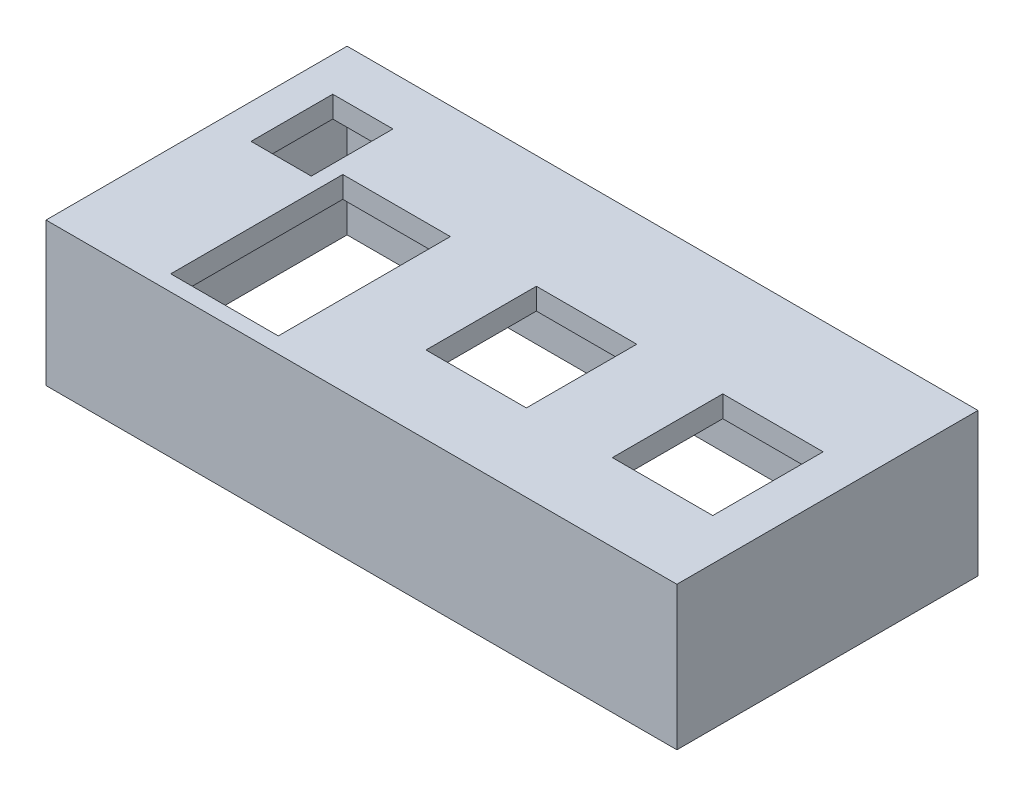
ISO-10303-21;
HEADER;
FILE_DESCRIPTION(('STEP AP214'),'2;1');
FILE_NAME('part.step','',(''),(''),'','','');
FILE_SCHEMA(('AUTOMOTIVE_DESIGN { 1 0 10303 214 1 1 1 1 }'));
ENDSEC;
DATA;
#1=APPLICATION_CONTEXT('core data for automotive mechanical design processes');
#2=APPLICATION_PROTOCOL_DEFINITION('international standard','automotive_design',2000,#1);
#3=PRODUCT_CONTEXT('',#1,'mechanical');
#4=PRODUCT('Part','Part','',(#3));
#5=PRODUCT_RELATED_PRODUCT_CATEGORY('part','',(#4));
#6=PRODUCT_DEFINITION_FORMATION('','',#4);
#7=PRODUCT_DEFINITION_CONTEXT('part definition',#1,'design');
#8=PRODUCT_DEFINITION('design','',#6,#7);
#9=PRODUCT_DEFINITION_SHAPE('','',#8);
#10=(LENGTH_UNIT() NAMED_UNIT(*) SI_UNIT(.MILLI.,.METRE.));
#11=(NAMED_UNIT(*) PLANE_ANGLE_UNIT() SI_UNIT($,.RADIAN.));
#12=(NAMED_UNIT(*) SI_UNIT($,.STERADIAN.) SOLID_ANGLE_UNIT());
#13=UNCERTAINTY_MEASURE_WITH_UNIT(LENGTH_MEASURE(1.E-05),#10,'distance_accuracy_value','');
#14=(GEOMETRIC_REPRESENTATION_CONTEXT(3) GLOBAL_UNCERTAINTY_ASSIGNED_CONTEXT((#13)) GLOBAL_UNIT_ASSIGNED_CONTEXT((#10,
#11,#12)) REPRESENTATION_CONTEXT('',''));
#15=CARTESIAN_POINT('',(0.,0.,0.));
#16=DIRECTION('',(0.,0.,1.));
#17=DIRECTION('',(1.,0.,0.));
#18=AXIS2_PLACEMENT_3D('',#15,#16,#17);
#19=CARTESIAN_POINT('',(0.,20.,0.));
#20=DIRECTION('',(0.,1.,0.));
#21=DIRECTION('',(0.,0.,1.));
#22=AXIS2_PLACEMENT_3D('',#19,#20,#21);
#23=PLANE('',#22);
#24=DIRECTION('',(0.,0.,1.));
#25=VECTOR('',#24,1.);
#26=CARTESIAN_POINT('',(-69.6030626637114,20.,0.590445487080586));
#27=LINE('',#26,#25);
#28=CARTESIAN_POINT('',(-69.6030626637114,20.,0.590445487080586));
#29=VERTEX_POINT('',#28);
#30=CARTESIAN_POINT('',(-69.6030626637114,20.,42.5904454870806));
#31=VERTEX_POINT('',#30);
#32=EDGE_CURVE('E346',#29,#31,#27,.T.);
#33=ORIENTED_EDGE('',*,*,#32,.T.);
#34=DIRECTION('',(1.,0.,0.));
#35=VECTOR('',#34,1.);
#36=CARTESIAN_POINT('',(-69.6030626637114,20.,42.5904454870806));
#37=LINE('',#36,#35);
#38=CARTESIAN_POINT('',(18.3969373362886,20.,42.5904454870806));
#39=VERTEX_POINT('',#38);
#40=EDGE_CURVE('E349',#31,#39,#37,.T.);
#41=ORIENTED_EDGE('',*,*,#40,.T.);
#42=DIRECTION('',(0.,0.,-1.));
#43=VECTOR('',#42,1.);
#44=CARTESIAN_POINT('',(18.3969373362885,20.,0.590445487080586));
#45=LINE('',#44,#43);
#46=CARTESIAN_POINT('',(18.3969373362885,20.,0.590445487080586));
#47=VERTEX_POINT('',#46);
#48=EDGE_CURVE('E352',#39,#47,#45,.T.);
#49=ORIENTED_EDGE('',*,*,#48,.T.);
#50=DIRECTION('',(-1.,0.,0.));
#51=VECTOR('',#50,1.);
#52=CARTESIAN_POINT('',(-69.6030626637114,20.,0.590445487080586));
#53=LINE('',#52,#51);
#54=EDGE_CURVE('E354',#47,#29,#53,.T.);
#55=ORIENTED_EDGE('',*,*,#54,.T.);
#56=EDGE_LOOP('',(#33,#41,#49,#55));
#57=FACE_BOUND('',#56,.T.);
#58=DIRECTION('',(-1.,0.,0.));
#59=VECTOR('',#58,1.);
#60=CARTESIAN_POINT('',(0.,20.,31.7904454870806));
#61=LINE('',#60,#59);
#62=CARTESIAN_POINT('',(12.5969373362886,20.,31.7904454870806));
#63=VERTEX_POINT('',#62);
#64=CARTESIAN_POINT('',(-1.40306266371144,20.,31.7904454870806));
#65=VERTEX_POINT('',#64);
#66=EDGE_CURVE('E307',#63,#65,#61,.T.);
#67=ORIENTED_EDGE('',*,*,#66,.T.);
#68=DIRECTION('',(0.,0.,-1.));
#69=VECTOR('',#68,1.);
#70=CARTESIAN_POINT('',(-1.40306266371144,20.,0.));
#71=LINE('',#70,#69);
#72=CARTESIAN_POINT('',(-1.40306266371144,20.,16.3904454870806));
#73=VERTEX_POINT('',#72);
#74=EDGE_CURVE('E310',#65,#73,#71,.T.);
#75=ORIENTED_EDGE('',*,*,#74,.T.);
#76=DIRECTION('',(1.,0.,0.));
#77=VECTOR('',#76,1.);
#78=CARTESIAN_POINT('',(0.,20.,16.3904454870806));
#79=LINE('',#78,#77);
#80=CARTESIAN_POINT('',(12.5969373362886,20.,16.3904454870806));
#81=VERTEX_POINT('',#80);
#82=EDGE_CURVE('E301',#73,#81,#79,.T.);
#83=ORIENTED_EDGE('',*,*,#82,.T.);
#84=DIRECTION('',(0.,0.,1.));
#85=VECTOR('',#84,1.);
#86=CARTESIAN_POINT('',(12.5969373362886,20.,0.));
#87=LINE('',#86,#85);
#88=EDGE_CURVE('E304',#81,#63,#87,.T.);
#89=ORIENTED_EDGE('',*,*,#88,.T.);
#90=EDGE_LOOP('',(#67,#75,#83,#89));
#91=FACE_BOUND('',#90,.T.);
#92=DIRECTION('',(-1.,0.,0.));
#93=VECTOR('',#92,1.);
#94=CARTESIAN_POINT('',(0.,20.,18.7904454870806));
#95=LINE('',#94,#93);
#96=CARTESIAN_POINT('',(-56.4030626637114,20.,18.7904454870806));
#97=VERTEX_POINT('',#96);
#98=CARTESIAN_POINT('',(-64.8030626637114,20.,18.7904454870806));
#99=VERTEX_POINT('',#98);
#100=EDGE_CURVE('E269',#97,#99,#95,.T.);
#101=ORIENTED_EDGE('',*,*,#100,.T.);
#102=DIRECTION('',(0.,0.,-1.));
#103=VECTOR('',#102,1.);
#104=CARTESIAN_POINT('',(-64.8030626637114,20.,0.));
#105=LINE('',#104,#103);
#106=CARTESIAN_POINT('',(-64.8030626637114,20.,7.39044548708059));
#107=VERTEX_POINT('',#106);
#108=EDGE_CURVE('E272',#99,#107,#105,.T.);
#109=ORIENTED_EDGE('',*,*,#108,.T.);
#110=DIRECTION('',(1.,0.,0.));
#111=VECTOR('',#110,1.);
#112=CARTESIAN_POINT('',(0.,20.,7.39044548708059));
#113=LINE('',#112,#111);
#114=CARTESIAN_POINT('',(-56.4030626637114,20.,7.39044548708059));
#115=VERTEX_POINT('',#114);
#116=EDGE_CURVE('E263',#107,#115,#113,.T.);
#117=ORIENTED_EDGE('',*,*,#116,.T.);
#118=DIRECTION('',(0.,0.,1.));
#119=VECTOR('',#118,1.);
#120=CARTESIAN_POINT('',(-56.4030626637114,20.,0.));
#121=LINE('',#120,#119);
#122=EDGE_CURVE('E266',#115,#97,#121,.T.);
#123=ORIENTED_EDGE('',*,*,#122,.T.);
#124=EDGE_LOOP('',(#101,#109,#117,#123));
#125=FACE_BOUND('',#124,.T.);
#126=DIRECTION('',(-1.,0.,0.));
#127=VECTOR('',#126,1.);
#128=CARTESIAN_POINT('',(0.,20.,40.3904454870806));
#129=LINE('',#128,#127);
#130=CARTESIAN_POINT('',(-39.4030626637114,20.,40.3904454870806));
#131=VERTEX_POINT('',#130);
#132=CARTESIAN_POINT('',(-54.4030626637114,20.,40.3904454870806));
#133=VERTEX_POINT('',#132);
#134=EDGE_CURVE('E261',#131,#133,#129,.T.);
#135=ORIENTED_EDGE('',*,*,#134,.T.);
#136=DIRECTION('',(0.,0.,-1.));
#137=VECTOR('',#136,1.);
#138=CARTESIAN_POINT('',(-54.4030626637114,20.,0.));
#139=LINE('',#138,#137);
#140=CARTESIAN_POINT('',(-54.4030626637114,20.,16.3904454870806));
#141=VERTEX_POINT('',#140);
#142=EDGE_CURVE('E212',#133,#141,#139,.T.);
#143=ORIENTED_EDGE('',*,*,#142,.T.);
#144=DIRECTION('',(1.,0.,0.));
#145=VECTOR('',#144,1.);
#146=CARTESIAN_POINT('',(0.,20.,16.3904454870806));
#147=LINE('',#146,#145);
#148=CARTESIAN_POINT('',(-39.4030626637114,20.,16.3904454870806));
#149=VERTEX_POINT('',#148);
#150=EDGE_CURVE('E275',#141,#149,#147,.T.);
#151=ORIENTED_EDGE('',*,*,#150,.T.);
#152=DIRECTION('',(0.,0.,1.));
#153=VECTOR('',#152,1.);
#154=CARTESIAN_POINT('',(-39.4030626637114,20.,0.));
#155=LINE('',#154,#153);
#156=EDGE_CURVE('E255',#149,#131,#155,.T.);
#157=ORIENTED_EDGE('',*,*,#156,.T.);
#158=EDGE_LOOP('',(#135,#143,#151,#157));
#159=FACE_BOUND('',#158,.T.);
#160=DIRECTION('',(-1.,0.,0.));
#161=VECTOR('',#160,1.);
#162=CARTESIAN_POINT('',(0.,20.,31.7904454870806));
#163=LINE('',#162,#161);
#164=CARTESIAN_POINT('',(-13.4030626637114,20.,31.7904454870806));
#165=VERTEX_POINT('',#164);
#166=CARTESIAN_POINT('',(-27.4030626637114,20.,31.7904454870806));
#167=VERTEX_POINT('',#166);
#168=EDGE_CURVE('E284',#165,#167,#163,.T.);
#169=ORIENTED_EDGE('',*,*,#168,.T.);
#170=DIRECTION('',(0.,0.,-1.));
#171=VECTOR('',#170,1.);
#172=CARTESIAN_POINT('',(-27.4030626637114,20.,0.));
#173=LINE('',#172,#171);
#174=CARTESIAN_POINT('',(-27.4030626637114,20.,16.3904454870806));
#175=VERTEX_POINT('',#174);
#176=EDGE_CURVE('E287',#167,#175,#173,.T.);
#177=ORIENTED_EDGE('',*,*,#176,.T.);
#178=DIRECTION('',(1.,0.,0.));
#179=VECTOR('',#178,1.);
#180=CARTESIAN_POINT('',(0.,20.,16.3904454870806));
#181=LINE('',#180,#179);
#182=CARTESIAN_POINT('',(-13.4030626637114,20.,16.3904454870806));
#183=VERTEX_POINT('',#182);
#184=EDGE_CURVE('E278',#175,#183,#181,.T.);
#185=ORIENTED_EDGE('',*,*,#184,.T.);
#186=DIRECTION('',(0.,0.,1.));
#187=VECTOR('',#186,1.);
#188=CARTESIAN_POINT('',(-13.4030626637114,20.,0.));
#189=LINE('',#188,#187);
#190=EDGE_CURVE('E281',#183,#165,#189,.T.);
#191=ORIENTED_EDGE('',*,*,#190,.T.);
#192=EDGE_LOOP('',(#169,#177,#185,#191));
#193=FACE_BOUND('',#192,.T.);
#194=ADVANCED_FACE('F32',(#57,#91,#125,#159,#193),#23,.T.);
#195=CARTESIAN_POINT('',(0.,17.,0.));
#196=DIRECTION('',(0.,1.,0.));
#197=DIRECTION('',(0.,0.,1.));
#198=AXIS2_PLACEMENT_3D('',#195,#196,#197);
#199=PLANE('',#198);
#200=DIRECTION('',(0.,0.,-1.));
#201=VECTOR('',#200,1.);
#202=CARTESIAN_POINT('',(-54.4030626637114,17.,0.));
#203=LINE('',#202,#201);
#204=CARTESIAN_POINT('',(-54.4030626637114,17.,39.7904454870806));
#205=VERTEX_POINT('',#204);
#206=CARTESIAN_POINT('',(-54.4030626637114,17.,16.3904454870806));
#207=VERTEX_POINT('',#206);
#208=EDGE_CURVE('E258',#205,#207,#203,.T.);
#209=ORIENTED_EDGE('',*,*,#208,.F.);
#210=DIRECTION('',(1.,0.,0.));
#211=VECTOR('',#210,1.);
#212=CARTESIAN_POINT('',(-66.8030626637114,17.,39.7904454870806));
#213=LINE('',#212,#211);
#214=CARTESIAN_POINT('',(-66.8030626637114,17.,39.7904454870806));
#215=VERTEX_POINT('',#214);
#216=EDGE_CURVE('E319',#215,#205,#213,.T.);
#217=ORIENTED_EDGE('',*,*,#216,.F.);
#218=DIRECTION('',(0.,0.,1.));
#219=VECTOR('',#218,1.);
#220=CARTESIAN_POINT('',(-66.8030626637114,17.,3.39044548708059));
#221=LINE('',#220,#219);
#222=CARTESIAN_POINT('',(-66.8030626637114,17.,3.39044548708059));
#223=VERTEX_POINT('',#222);
#224=EDGE_CURVE('E314',#223,#215,#221,.T.);
#225=ORIENTED_EDGE('',*,*,#224,.F.);
#226=DIRECTION('',(-1.,0.,0.));
#227=VECTOR('',#226,1.);
#228=CARTESIAN_POINT('',(-66.8030626637114,17.,3.39044548708059));
#229=LINE('',#228,#227);
#230=CARTESIAN_POINT('',(15.5969373362886,17.,3.39044548708059));
#231=VERTEX_POINT('',#230);
#232=EDGE_CURVE('E324',#231,#223,#229,.T.);
#233=ORIENTED_EDGE('',*,*,#232,.F.);
#234=DIRECTION('',(0.,0.,-1.));
#235=VECTOR('',#234,1.);
#236=CARTESIAN_POINT('',(15.5969373362886,17.,3.39044548708059));
#237=LINE('',#236,#235);
#238=CARTESIAN_POINT('',(15.5969373362886,17.,39.7904454870806));
#239=VERTEX_POINT('',#238);
#240=EDGE_CURVE('E322',#239,#231,#237,.T.);
#241=ORIENTED_EDGE('',*,*,#240,.F.);
#242=CARTESIAN_POINT('',(-39.4030626637114,17.,39.7904454870806));
#243=VERTEX_POINT('',#242);
#244=EDGE_CURVE('E317',#243,#239,#213,.T.);
#245=ORIENTED_EDGE('',*,*,#244,.F.);
#246=DIRECTION('',(0.,0.,1.));
#247=VECTOR('',#246,1.);
#248=CARTESIAN_POINT('',(-39.4030626637114,17.,0.));
#249=LINE('',#248,#247);
#250=CARTESIAN_POINT('',(-39.4030626637114,17.,16.3904454870806));
#251=VERTEX_POINT('',#250);
#252=EDGE_CURVE('E253',#251,#243,#249,.T.);
#253=ORIENTED_EDGE('',*,*,#252,.F.);
#254=DIRECTION('',(1.,0.,0.));
#255=VECTOR('',#254,1.);
#256=CARTESIAN_POINT('',(0.,17.,16.3904454870806));
#257=LINE('',#256,#255);
#258=EDGE_CURVE('E398',#207,#251,#257,.T.);
#259=ORIENTED_EDGE('',*,*,#258,.F.);
#260=EDGE_LOOP('',(#209,#217,#225,#233,#241,#245,#253,#259));
#261=FACE_BOUND('',#260,.T.);
#262=DIRECTION('',(0.,0.,-1.));
#263=VECTOR('',#262,1.);
#264=CARTESIAN_POINT('',(-1.40306266371144,17.,0.));
#265=LINE('',#264,#263);
#266=CARTESIAN_POINT('',(-1.40306266371144,17.,31.7904454870806));
#267=VERTEX_POINT('',#266);
#268=CARTESIAN_POINT('',(-1.40306266371144,17.,16.3904454870806));
#269=VERTEX_POINT('',#268);
#270=EDGE_CURVE('E381',#267,#269,#265,.T.);
#271=ORIENTED_EDGE('',*,*,#270,.F.);
#272=DIRECTION('',(-1.,0.,0.));
#273=VECTOR('',#272,1.);
#274=CARTESIAN_POINT('',(0.,17.,31.7904454870806));
#275=LINE('',#274,#273);
#276=CARTESIAN_POINT('',(12.5969373362886,17.,31.7904454870806));
#277=VERTEX_POINT('',#276);
#278=EDGE_CURVE('E379',#277,#267,#275,.T.);
#279=ORIENTED_EDGE('',*,*,#278,.F.);
#280=DIRECTION('',(0.,0.,1.));
#281=VECTOR('',#280,1.);
#282=CARTESIAN_POINT('',(12.5969373362886,17.,0.));
#283=LINE('',#282,#281);
#284=CARTESIAN_POINT('',(12.5969373362886,17.,16.3904454870806));
#285=VERTEX_POINT('',#284);
#286=EDGE_CURVE('E377',#285,#277,#283,.T.);
#287=ORIENTED_EDGE('',*,*,#286,.F.);
#288=DIRECTION('',(1.,0.,0.));
#289=VECTOR('',#288,1.);
#290=CARTESIAN_POINT('',(0.,17.,16.3904454870806));
#291=LINE('',#290,#289);
#292=EDGE_CURVE('E375',#269,#285,#291,.T.);
#293=ORIENTED_EDGE('',*,*,#292,.F.);
#294=EDGE_LOOP('',(#271,#279,#287,#293));
#295=FACE_BOUND('',#294,.T.);
#296=DIRECTION('',(0.,0.,-1.));
#297=VECTOR('',#296,1.);
#298=CARTESIAN_POINT('',(-64.8030626637114,17.,0.));
#299=LINE('',#298,#297);
#300=CARTESIAN_POINT('',(-64.8030626637114,17.,18.7904454870806));
#301=VERTEX_POINT('',#300);
#302=CARTESIAN_POINT('',(-64.8030626637114,17.,7.39044548708059));
#303=VERTEX_POINT('',#302);
#304=EDGE_CURVE('E395',#301,#303,#299,.T.);
#305=ORIENTED_EDGE('',*,*,#304,.F.);
#306=DIRECTION('',(-1.,0.,0.));
#307=VECTOR('',#306,1.);
#308=CARTESIAN_POINT('',(0.,17.,18.7904454870806));
#309=LINE('',#308,#307);
#310=CARTESIAN_POINT('',(-56.4030626637114,17.,18.7904454870806));
#311=VERTEX_POINT('',#310);
#312=EDGE_CURVE('E393',#311,#301,#309,.T.);
#313=ORIENTED_EDGE('',*,*,#312,.F.);
#314=DIRECTION('',(0.,0.,1.));
#315=VECTOR('',#314,1.);
#316=CARTESIAN_POINT('',(-56.4030626637114,17.,0.));
#317=LINE('',#316,#315);
#318=CARTESIAN_POINT('',(-56.4030626637114,17.,7.39044548708059));
#319=VERTEX_POINT('',#318);
#320=EDGE_CURVE('E391',#319,#311,#317,.T.);
#321=ORIENTED_EDGE('',*,*,#320,.F.);
#322=DIRECTION('',(1.,0.,0.));
#323=VECTOR('',#322,1.);
#324=CARTESIAN_POINT('',(0.,17.,7.39044548708059));
#325=LINE('',#324,#323);
#326=EDGE_CURVE('E389',#303,#319,#325,.T.);
#327=ORIENTED_EDGE('',*,*,#326,.F.);
#328=EDGE_LOOP('',(#305,#313,#321,#327));
#329=FACE_BOUND('',#328,.T.);
#330=DIRECTION('',(0.,0.,-1.));
#331=VECTOR('',#330,1.);
#332=CARTESIAN_POINT('',(-27.4030626637114,17.,0.));
#333=LINE('',#332,#331);
#334=CARTESIAN_POINT('',(-27.4030626637114,17.,31.7904454870806));
#335=VERTEX_POINT('',#334);
#336=CARTESIAN_POINT('',(-27.4030626637114,17.,16.3904454870806));
#337=VERTEX_POINT('',#336);
#338=EDGE_CURVE('E11',#335,#337,#333,.T.);
#339=ORIENTED_EDGE('',*,*,#338,.F.);
#340=DIRECTION('',(-1.,0.,0.));
#341=VECTOR('',#340,1.);
#342=CARTESIAN_POINT('',(0.,17.,31.7904454870806));
#343=LINE('',#342,#341);
#344=CARTESIAN_POINT('',(-13.4030626637114,17.,31.7904454870806));
#345=VERTEX_POINT('',#344);
#346=EDGE_CURVE('E40',#345,#335,#343,.T.);
#347=ORIENTED_EDGE('',*,*,#346,.F.);
#348=DIRECTION('',(0.,0.,1.));
#349=VECTOR('',#348,1.);
#350=CARTESIAN_POINT('',(-13.4030626637114,17.,0.));
#351=LINE('',#350,#349);
#352=CARTESIAN_POINT('',(-13.4030626637114,17.,16.3904454870806));
#353=VERTEX_POINT('',#352);
#354=EDGE_CURVE('E402',#353,#345,#351,.T.);
#355=ORIENTED_EDGE('',*,*,#354,.F.);
#356=DIRECTION('',(1.,0.,0.));
#357=VECTOR('',#356,1.);
#358=CARTESIAN_POINT('',(0.,17.,16.3904454870806));
#359=LINE('',#358,#357);
#360=EDGE_CURVE('E400',#337,#353,#359,.T.);
#361=ORIENTED_EDGE('',*,*,#360,.F.);
#362=EDGE_LOOP('',(#339,#347,#355,#361));
#363=FACE_BOUND('',#362,.T.);
#364=ADVANCED_FACE('F418',(#261,#295,#329,#363),#199,.F.);
#365=CARTESIAN_POINT('',(0.,0.,0.));
#366=DIRECTION('',(0.,1.,0.));
#367=DIRECTION('',(0.,0.,1.));
#368=AXIS2_PLACEMENT_3D('',#365,#366,#367);
#369=PLANE('',#368);
#370=DIRECTION('',(0.,0.,1.));
#371=VECTOR('',#370,1.);
#372=CARTESIAN_POINT('',(-69.6030626637114,0.,0.590445487080586));
#373=LINE('',#372,#371);
#374=CARTESIAN_POINT('',(-69.6030626637114,0.,0.590445487080586));
#375=VERTEX_POINT('',#374);
#376=CARTESIAN_POINT('',(-69.6030626637114,0.,42.5904454870806));
#377=VERTEX_POINT('',#376);
#378=EDGE_CURVE('E345',#375,#377,#373,.T.);
#379=ORIENTED_EDGE('',*,*,#378,.F.);
#380=DIRECTION('',(-1.,0.,0.));
#381=VECTOR('',#380,1.);
#382=CARTESIAN_POINT('',(-69.6030626637114,0.,0.590445487080586));
#383=LINE('',#382,#381);
#384=CARTESIAN_POINT('',(18.3969373362885,0.,0.590445487080586));
#385=VERTEX_POINT('',#384);
#386=EDGE_CURVE('E350',#385,#375,#383,.T.);
#387=ORIENTED_EDGE('',*,*,#386,.F.);
#388=DIRECTION('',(0.,0.,-1.));
#389=VECTOR('',#388,1.);
#390=CARTESIAN_POINT('',(18.3969373362885,0.,0.590445487080586));
#391=LINE('',#390,#389);
#392=CARTESIAN_POINT('',(18.3969373362886,0.,42.5904454870806));
#393=VERTEX_POINT('',#392);
#394=EDGE_CURVE('E361',#393,#385,#391,.T.);
#395=ORIENTED_EDGE('',*,*,#394,.F.);
#396=DIRECTION('',(1.,0.,0.));
#397=VECTOR('',#396,1.);
#398=CARTESIAN_POINT('',(-69.6030626637114,0.,42.5904454870806));
#399=LINE('',#398,#397);
#400=EDGE_CURVE('E359',#377,#393,#399,.T.);
#401=ORIENTED_EDGE('',*,*,#400,.F.);
#402=EDGE_LOOP('',(#379,#387,#395,#401));
#403=FACE_BOUND('',#402,.T.);
#404=DIRECTION('',(0.,0.,1.));
#405=VECTOR('',#404,1.);
#406=CARTESIAN_POINT('',(-54.4030626637114,0.,40.3904454870806));
#407=LINE('',#406,#405);
#408=CARTESIAN_POINT('',(-54.4030626637114,0.,39.7904454870806));
#409=VERTEX_POINT('',#408);
#410=CARTESIAN_POINT('',(-54.4030626637114,0.,40.3904454870806));
#411=VERTEX_POINT('',#410);
#412=EDGE_CURVE('E208',#409,#411,#407,.T.);
#413=ORIENTED_EDGE('',*,*,#412,.T.);
#414=DIRECTION('',(1.,0.,0.));
#415=VECTOR('',#414,1.);
#416=CARTESIAN_POINT('',(-54.4030626637114,0.,40.3904454870806));
#417=LINE('',#416,#415);
#418=CARTESIAN_POINT('',(-39.4030626637114,0.,40.3904454870806));
#419=VERTEX_POINT('',#418);
#420=EDGE_CURVE('E219',#411,#419,#417,.T.);
#421=ORIENTED_EDGE('',*,*,#420,.T.);
#422=DIRECTION('',(0.,0.,-1.));
#423=VECTOR('',#422,1.);
#424=CARTESIAN_POINT('',(-39.4030626637114,0.,40.3904454870806));
#425=LINE('',#424,#423);
#426=CARTESIAN_POINT('',(-39.4030626637114,0.,39.7904454870806));
#427=VERTEX_POINT('',#426);
#428=EDGE_CURVE('E225',#419,#427,#425,.T.);
#429=ORIENTED_EDGE('',*,*,#428,.T.);
#430=DIRECTION('',(1.,0.,0.));
#431=VECTOR('',#430,1.);
#432=CARTESIAN_POINT('',(-66.8030626637114,0.,39.7904454870806));
#433=LINE('',#432,#431);
#434=CARTESIAN_POINT('',(15.5969373362886,0.,39.7904454870806));
#435=VERTEX_POINT('',#434);
#436=EDGE_CURVE('E328',#427,#435,#433,.T.);
#437=ORIENTED_EDGE('',*,*,#436,.T.);
#438=DIRECTION('',(0.,0.,-1.));
#439=VECTOR('',#438,1.);
#440=CARTESIAN_POINT('',(15.5969373362886,0.,3.39044548708059));
#441=LINE('',#440,#439);
#442=CARTESIAN_POINT('',(15.5969373362886,0.,3.39044548708059));
#443=VERTEX_POINT('',#442);
#444=EDGE_CURVE('E330',#435,#443,#441,.T.);
#445=ORIENTED_EDGE('',*,*,#444,.T.);
#446=DIRECTION('',(-1.,0.,0.));
#447=VECTOR('',#446,1.);
#448=CARTESIAN_POINT('',(-66.8030626637114,0.,3.39044548708059));
#449=LINE('',#448,#447);
#450=CARTESIAN_POINT('',(-66.8030626637114,0.,3.39044548708059));
#451=VERTEX_POINT('',#450);
#452=EDGE_CURVE('E318',#443,#451,#449,.T.);
#453=ORIENTED_EDGE('',*,*,#452,.T.);
#454=DIRECTION('',(0.,0.,1.));
#455=VECTOR('',#454,1.);
#456=CARTESIAN_POINT('',(-66.8030626637114,0.,3.39044548708059));
#457=LINE('',#456,#455);
#458=CARTESIAN_POINT('',(-66.8030626637114,0.,39.7904454870806));
#459=VERTEX_POINT('',#458);
#460=EDGE_CURVE('E313',#451,#459,#457,.T.);
#461=ORIENTED_EDGE('',*,*,#460,.T.);
#462=EDGE_CURVE('E230',#459,#409,#433,.T.);
#463=ORIENTED_EDGE('',*,*,#462,.T.);
#464=EDGE_LOOP('',(#413,#421,#429,#437,#445,#453,#461,#463));
#465=FACE_BOUND('',#464,.T.);
#466=ADVANCED_FACE('F228',(#403,#465),#369,.F.);
#467=CARTESIAN_POINT('',(-66.8030626637114,17.,39.7904454870806));
#468=DIRECTION('',(0.,0.,-1.));
#469=DIRECTION('',(-1.,0.,0.));
#470=AXIS2_PLACEMENT_3D('',#467,#468,#469);
#471=PLANE('',#470);
#472=ORIENTED_EDGE('',*,*,#216,.T.);
#473=DIRECTION('',(0.,-1.,0.));
#474=VECTOR('',#473,1.);
#475=CARTESIAN_POINT('',(-54.4030626637114,17.,39.7904454870806));
#476=LINE('',#475,#474);
#477=EDGE_CURVE('E387',#205,#409,#476,.T.);
#478=ORIENTED_EDGE('',*,*,#477,.T.);
#479=ORIENTED_EDGE('',*,*,#462,.F.);
#480=DIRECTION('',(0.,-1.,0.));
#481=VECTOR('',#480,1.);
#482=CARTESIAN_POINT('',(-66.8030626637114,17.,39.7904454870806));
#483=LINE('',#482,#481);
#484=EDGE_CURVE('E342',#215,#459,#483,.T.);
#485=ORIENTED_EDGE('',*,*,#484,.F.);
#486=EDGE_LOOP('',(#472,#478,#479,#485));
#487=FACE_BOUND('',#486,.T.);
#488=ADVANCED_FACE('F440',(#487),#471,.T.);
#489=ORIENTED_EDGE('',*,*,#436,.F.);
#490=DIRECTION('',(0.,1.,0.));
#491=VECTOR('',#490,1.);
#492=CARTESIAN_POINT('',(-39.4030626637114,17.,39.7904454870806));
#493=LINE('',#492,#491);
#494=EDGE_CURVE('E384',#427,#243,#493,.T.);
#495=ORIENTED_EDGE('',*,*,#494,.T.);
#496=ORIENTED_EDGE('',*,*,#244,.T.);
#497=DIRECTION('',(0.,-1.,0.));
#498=VECTOR('',#497,1.);
#499=CARTESIAN_POINT('',(15.5969373362886,17.,39.7904454870806));
#500=LINE('',#499,#498);
#501=EDGE_CURVE('E339',#239,#435,#500,.T.);
#502=ORIENTED_EDGE('',*,*,#501,.T.);
#503=EDGE_LOOP('',(#489,#495,#496,#502));
#504=FACE_BOUND('',#503,.T.);
#505=ADVANCED_FACE('F455',(#504),#471,.T.);
#506=CARTESIAN_POINT('',(-69.6030626637114,20.,0.590445487080586));
#507=DIRECTION('',(1.,0.,0.));
#508=DIRECTION('',(0.,0.,-1.));
#509=AXIS2_PLACEMENT_3D('',#506,#507,#508);
#510=PLANE('',#509);
#511=ORIENTED_EDGE('',*,*,#378,.T.);
#512=DIRECTION('',(0.,-1.,0.));
#513=VECTOR('',#512,1.);
#514=CARTESIAN_POINT('',(-69.6030626637114,20.,42.5904454870806));
#515=LINE('',#514,#513);
#516=EDGE_CURVE('E372',#31,#377,#515,.T.);
#517=ORIENTED_EDGE('',*,*,#516,.F.);
#518=ORIENTED_EDGE('',*,*,#32,.F.);
#519=DIRECTION('',(0.,-1.,0.));
#520=VECTOR('',#519,1.);
#521=CARTESIAN_POINT('',(-69.6030626637114,20.,0.590445487080586));
#522=LINE('',#521,#520);
#523=EDGE_CURVE('E356',#29,#375,#522,.T.);
#524=ORIENTED_EDGE('',*,*,#523,.T.);
#525=EDGE_LOOP('',(#511,#517,#518,#524));
#526=FACE_BOUND('',#525,.T.);
#527=ADVANCED_FACE('F34',(#526),#510,.F.);
#528=CARTESIAN_POINT('',(-69.6030626637114,20.,42.5904454870806));
#529=DIRECTION('',(0.,0.,-1.));
#530=DIRECTION('',(-1.,0.,0.));
#531=AXIS2_PLACEMENT_3D('',#528,#529,#530);
#532=PLANE('',#531);
#533=ORIENTED_EDGE('',*,*,#400,.T.);
#534=DIRECTION('',(0.,-1.,0.));
#535=VECTOR('',#534,1.);
#536=CARTESIAN_POINT('',(18.3969373362886,20.,42.5904454870806));
#537=LINE('',#536,#535);
#538=EDGE_CURVE('E369',#39,#393,#537,.T.);
#539=ORIENTED_EDGE('',*,*,#538,.F.);
#540=ORIENTED_EDGE('',*,*,#40,.F.);
#541=ORIENTED_EDGE('',*,*,#516,.T.);
#542=EDGE_LOOP('',(#533,#539,#540,#541));
#543=FACE_BOUND('',#542,.T.);
#544=ADVANCED_FACE('F448',(#543),#532,.F.);
#545=CARTESIAN_POINT('',(18.3969373362885,20.,0.590445487080586));
#546=DIRECTION('',(-1.,0.,0.));
#547=DIRECTION('',(0.,0.,1.));
#548=AXIS2_PLACEMENT_3D('',#545,#546,#547);
#549=PLANE('',#548);
#550=ORIENTED_EDGE('',*,*,#394,.T.);
#551=DIRECTION('',(0.,-1.,0.));
#552=VECTOR('',#551,1.);
#553=CARTESIAN_POINT('',(18.3969373362885,20.,0.590445487080586));
#554=LINE('',#553,#552);
#555=EDGE_CURVE('E366',#47,#385,#554,.T.);
#556=ORIENTED_EDGE('',*,*,#555,.F.);
#557=ORIENTED_EDGE('',*,*,#48,.F.);
#558=ORIENTED_EDGE('',*,*,#538,.T.);
#559=EDGE_LOOP('',(#550,#556,#557,#558));
#560=FACE_BOUND('',#559,.T.);
#561=ADVANCED_FACE('F445',(#560),#549,.F.);
#562=CARTESIAN_POINT('',(-69.6030626637114,20.,0.590445487080586));
#563=DIRECTION('',(0.,0.,1.));
#564=DIRECTION('',(1.,0.,0.));
#565=AXIS2_PLACEMENT_3D('',#562,#563,#564);
#566=PLANE('',#565);
#567=ORIENTED_EDGE('',*,*,#386,.T.);
#568=ORIENTED_EDGE('',*,*,#523,.F.);
#569=ORIENTED_EDGE('',*,*,#54,.F.);
#570=ORIENTED_EDGE('',*,*,#555,.T.);
#571=EDGE_LOOP('',(#567,#568,#569,#570));
#572=FACE_BOUND('',#571,.T.);
#573=ADVANCED_FACE('F442',(#572),#566,.F.);
#574=CARTESIAN_POINT('',(-66.8030626637114,17.,3.39044548708059));
#575=DIRECTION('',(1.,0.,0.));
#576=DIRECTION('',(0.,0.,-1.));
#577=AXIS2_PLACEMENT_3D('',#574,#575,#576);
#578=PLANE('',#577);
#579=ORIENTED_EDGE('',*,*,#460,.F.);
#580=DIRECTION('',(0.,-1.,0.));
#581=VECTOR('',#580,1.);
#582=CARTESIAN_POINT('',(-66.8030626637114,17.,3.39044548708059));
#583=LINE('',#582,#581);
#584=EDGE_CURVE('E326',#223,#451,#583,.T.);
#585=ORIENTED_EDGE('',*,*,#584,.F.);
#586=ORIENTED_EDGE('',*,*,#224,.T.);
#587=ORIENTED_EDGE('',*,*,#484,.T.);
#588=EDGE_LOOP('',(#579,#585,#586,#587));
#589=FACE_BOUND('',#588,.T.);
#590=ADVANCED_FACE('F436',(#589),#578,.T.);
#591=CARTESIAN_POINT('',(15.5969373362886,17.,3.39044548708059));
#592=DIRECTION('',(-1.,0.,0.));
#593=DIRECTION('',(0.,0.,1.));
#594=AXIS2_PLACEMENT_3D('',#591,#592,#593);
#595=PLANE('',#594);
#596=ORIENTED_EDGE('',*,*,#444,.F.);
#597=ORIENTED_EDGE('',*,*,#501,.F.);
#598=ORIENTED_EDGE('',*,*,#240,.T.);
#599=DIRECTION('',(0.,-1.,0.));
#600=VECTOR('',#599,1.);
#601=CARTESIAN_POINT('',(15.5969373362886,17.,3.39044548708059));
#602=LINE('',#601,#600);
#603=EDGE_CURVE('E337',#231,#443,#602,.T.);
#604=ORIENTED_EDGE('',*,*,#603,.T.);
#605=EDGE_LOOP('',(#596,#597,#598,#604));
#606=FACE_BOUND('',#605,.T.);
#607=ADVANCED_FACE('F477',(#606),#595,.T.);
#608=CARTESIAN_POINT('',(-66.8030626637114,17.,3.39044548708059));
#609=DIRECTION('',(0.,0.,1.));
#610=DIRECTION('',(1.,0.,0.));
#611=AXIS2_PLACEMENT_3D('',#608,#609,#610);
#612=PLANE('',#611);
#613=ORIENTED_EDGE('',*,*,#452,.F.);
#614=ORIENTED_EDGE('',*,*,#603,.F.);
#615=ORIENTED_EDGE('',*,*,#232,.T.);
#616=ORIENTED_EDGE('',*,*,#584,.T.);
#617=EDGE_LOOP('',(#613,#614,#615,#616));
#618=FACE_BOUND('',#617,.T.);
#619=ADVANCED_FACE('F480',(#618),#612,.T.);
#620=CARTESIAN_POINT('',(-1.40306266371144,53.,31.7904454870806));
#621=DIRECTION('',(1.,0.,0.));
#622=DIRECTION('',(0.,0.,-1.));
#623=AXIS2_PLACEMENT_3D('',#620,#621,#622);
#624=PLANE('',#623);
#625=DIRECTION('',(0.,-1.,0.));
#626=VECTOR('',#625,1.);
#627=CARTESIAN_POINT('',(-1.40306266371144,53.,31.7904454870806));
#628=LINE('',#627,#626);
#629=EDGE_CURVE('E298',#65,#267,#628,.T.);
#630=ORIENTED_EDGE('',*,*,#629,.T.);
#631=ORIENTED_EDGE('',*,*,#270,.T.);
#632=DIRECTION('',(0.,-1.,0.));
#633=VECTOR('',#632,1.);
#634=CARTESIAN_POINT('',(-1.40306266371144,53.,16.3904454870806));
#635=LINE('',#634,#633);
#636=EDGE_CURVE('E290',#73,#269,#635,.T.);
#637=ORIENTED_EDGE('',*,*,#636,.F.);
#638=ORIENTED_EDGE('',*,*,#74,.F.);
#639=EDGE_LOOP('',(#630,#631,#637,#638));
#640=FACE_BOUND('',#639,.T.);
#641=ADVANCED_FACE('F483',(#640),#624,.T.);
#642=CARTESIAN_POINT('',(-1.40306266371144,53.,31.7904454870806));
#643=DIRECTION('',(0.,0.,-1.));
#644=DIRECTION('',(-1.,0.,0.));
#645=AXIS2_PLACEMENT_3D('',#642,#643,#644);
#646=PLANE('',#645);
#647=DIRECTION('',(0.,-1.,0.));
#648=VECTOR('',#647,1.);
#649=CARTESIAN_POINT('',(12.5969373362886,53.,31.7904454870806));
#650=LINE('',#649,#648);
#651=EDGE_CURVE('E295',#63,#277,#650,.T.);
#652=ORIENTED_EDGE('',*,*,#651,.T.);
#653=ORIENTED_EDGE('',*,*,#278,.T.);
#654=ORIENTED_EDGE('',*,*,#629,.F.);
#655=ORIENTED_EDGE('',*,*,#66,.F.);
#656=EDGE_LOOP('',(#652,#653,#654,#655));
#657=FACE_BOUND('',#656,.T.);
#658=ADVANCED_FACE('F488',(#657),#646,.T.);
#659=CARTESIAN_POINT('',(12.5969373362886,53.,31.7904454870806));
#660=DIRECTION('',(-1.,0.,0.));
#661=DIRECTION('',(0.,0.,1.));
#662=AXIS2_PLACEMENT_3D('',#659,#660,#661);
#663=PLANE('',#662);
#664=DIRECTION('',(0.,-1.,0.));
#665=VECTOR('',#664,1.);
#666=CARTESIAN_POINT('',(12.5969373362886,53.,16.3904454870806));
#667=LINE('',#666,#665);
#668=EDGE_CURVE('E292',#81,#285,#667,.T.);
#669=ORIENTED_EDGE('',*,*,#668,.T.);
#670=ORIENTED_EDGE('',*,*,#286,.T.);
#671=ORIENTED_EDGE('',*,*,#651,.F.);
#672=ORIENTED_EDGE('',*,*,#88,.F.);
#673=EDGE_LOOP('',(#669,#670,#671,#672));
#674=FACE_BOUND('',#673,.T.);
#675=ADVANCED_FACE('F492',(#674),#663,.T.);
#676=CARTESIAN_POINT('',(-1.40306266371144,53.,16.3904454870806));
#677=DIRECTION('',(0.,0.,1.));
#678=DIRECTION('',(1.,0.,0.));
#679=AXIS2_PLACEMENT_3D('',#676,#677,#678);
#680=PLANE('',#679);
#681=ORIENTED_EDGE('',*,*,#636,.T.);
#682=ORIENTED_EDGE('',*,*,#292,.T.);
#683=ORIENTED_EDGE('',*,*,#668,.F.);
#684=ORIENTED_EDGE('',*,*,#82,.F.);
#685=EDGE_LOOP('',(#681,#682,#683,#684));
#686=FACE_BOUND('',#685,.T.);
#687=ADVANCED_FACE('F496',(#686),#680,.T.);
#688=CARTESIAN_POINT('',(-54.4030626637114,53.,16.3904454870806));
#689=DIRECTION('',(0.,0.,1.));
#690=DIRECTION('',(1.,0.,0.));
#691=AXIS2_PLACEMENT_3D('',#688,#689,#690);
#692=PLANE('',#691);
#693=DIRECTION('',(0.,-1.,0.));
#694=VECTOR('',#693,1.);
#695=CARTESIAN_POINT('',(-54.4030626637114,53.,16.3904454870806));
#696=LINE('',#695,#694);
#697=EDGE_CURVE('E241',#141,#207,#696,.T.);
#698=ORIENTED_EDGE('',*,*,#697,.T.);
#699=ORIENTED_EDGE('',*,*,#258,.T.);
#700=DIRECTION('',(0.,-1.,0.));
#701=VECTOR('',#700,1.);
#702=CARTESIAN_POINT('',(-39.4030626637114,53.,16.3904454870806));
#703=LINE('',#702,#701);
#704=EDGE_CURVE('E55',#149,#251,#703,.T.);
#705=ORIENTED_EDGE('',*,*,#704,.F.);
#706=ORIENTED_EDGE('',*,*,#150,.F.);
#707=EDGE_LOOP('',(#698,#699,#705,#706));
#708=FACE_BOUND('',#707,.T.);
#709=ADVANCED_FACE('F500',(#708),#692,.T.);
#710=CARTESIAN_POINT('',(-54.4030626637114,53.,40.3904454870806));
#711=DIRECTION('',(1.,0.,0.));
#712=DIRECTION('',(0.,0.,-1.));
#713=AXIS2_PLACEMENT_3D('',#710,#711,#712);
#714=PLANE('',#713);
#715=DIRECTION('',(0.,-1.,0.));
#716=VECTOR('',#715,1.);
#717=CARTESIAN_POINT('',(-54.4030626637114,53.,40.3904454870806));
#718=LINE('',#717,#716);
#719=EDGE_CURVE('E204',#133,#411,#718,.T.);
#720=ORIENTED_EDGE('',*,*,#719,.T.);
#721=ORIENTED_EDGE('',*,*,#412,.F.);
#722=ORIENTED_EDGE('',*,*,#477,.F.);
#723=ORIENTED_EDGE('',*,*,#208,.T.);
#724=ORIENTED_EDGE('',*,*,#697,.F.);
#725=ORIENTED_EDGE('',*,*,#142,.F.);
#726=EDGE_LOOP('',(#720,#721,#722,#723,#724,#725));
#727=FACE_BOUND('',#726,.T.);
#728=ADVANCED_FACE('F206',(#727),#714,.T.);
#729=CARTESIAN_POINT('',(-39.4030626637114,53.,40.3904454870806));
#730=DIRECTION('',(-1.,0.,0.));
#731=DIRECTION('',(0.,0.,1.));
#732=AXIS2_PLACEMENT_3D('',#729,#730,#731);
#733=PLANE('',#732);
#734=ORIENTED_EDGE('',*,*,#704,.T.);
#735=ORIENTED_EDGE('',*,*,#252,.T.);
#736=ORIENTED_EDGE('',*,*,#494,.F.);
#737=ORIENTED_EDGE('',*,*,#428,.F.);
#738=DIRECTION('',(0.,-1.,0.));
#739=VECTOR('',#738,1.);
#740=CARTESIAN_POINT('',(-39.4030626637114,53.,40.3904454870806));
#741=LINE('',#740,#739);
#742=EDGE_CURVE('E216',#131,#419,#741,.T.);
#743=ORIENTED_EDGE('',*,*,#742,.F.);
#744=ORIENTED_EDGE('',*,*,#156,.F.);
#745=EDGE_LOOP('',(#734,#735,#736,#737,#743,#744));
#746=FACE_BOUND('',#745,.T.);
#747=ADVANCED_FACE('F520',(#746),#733,.T.);
#748=CARTESIAN_POINT('',(-54.4030626637114,53.,40.3904454870806));
#749=DIRECTION('',(0.,0.,-1.));
#750=DIRECTION('',(-1.,0.,0.));
#751=AXIS2_PLACEMENT_3D('',#748,#749,#750);
#752=PLANE('',#751);
#753=ORIENTED_EDGE('',*,*,#742,.T.);
#754=ORIENTED_EDGE('',*,*,#420,.F.);
#755=ORIENTED_EDGE('',*,*,#719,.F.);
#756=ORIENTED_EDGE('',*,*,#134,.F.);
#757=EDGE_LOOP('',(#753,#754,#755,#756));
#758=FACE_BOUND('',#757,.T.);
#759=ADVANCED_FACE('F220',(#758),#752,.T.);
#760=CARTESIAN_POINT('',(-64.8030626637114,53.,18.7904454870806));
#761=DIRECTION('',(1.,0.,0.));
#762=DIRECTION('',(0.,0.,-1.));
#763=AXIS2_PLACEMENT_3D('',#760,#761,#762);
#764=PLANE('',#763);
#765=DIRECTION('',(0.,-1.,0.));
#766=VECTOR('',#765,1.);
#767=CARTESIAN_POINT('',(-64.8030626637114,53.,18.7904454870806));
#768=LINE('',#767,#766);
#769=EDGE_CURVE('E231',#99,#301,#768,.T.);
#770=ORIENTED_EDGE('',*,*,#769,.T.);
#771=ORIENTED_EDGE('',*,*,#304,.T.);
#772=DIRECTION('',(0.,-1.,0.));
#773=VECTOR('',#772,1.);
#774=CARTESIAN_POINT('',(-64.8030626637114,53.,7.39044548708059));
#775=LINE('',#774,#773);
#776=EDGE_CURVE('E246',#107,#303,#775,.T.);
#777=ORIENTED_EDGE('',*,*,#776,.F.);
#778=ORIENTED_EDGE('',*,*,#108,.F.);
#779=EDGE_LOOP('',(#770,#771,#777,#778));
#780=FACE_BOUND('',#779,.T.);
#781=ADVANCED_FACE('F502',(#780),#764,.T.);
#782=CARTESIAN_POINT('',(-64.8030626637114,53.,18.7904454870806));
#783=DIRECTION('',(0.,0.,-1.));
#784=DIRECTION('',(-1.,0.,0.));
#785=AXIS2_PLACEMENT_3D('',#782,#783,#784);
#786=PLANE('',#785);
#787=DIRECTION('',(0.,-1.,0.));
#788=VECTOR('',#787,1.);
#789=CARTESIAN_POINT('',(-56.4030626637114,53.,18.7904454870806));
#790=LINE('',#789,#788);
#791=EDGE_CURVE('E234',#97,#311,#790,.T.);
#792=ORIENTED_EDGE('',*,*,#791,.T.);
#793=ORIENTED_EDGE('',*,*,#312,.T.);
#794=ORIENTED_EDGE('',*,*,#769,.F.);
#795=ORIENTED_EDGE('',*,*,#100,.F.);
#796=EDGE_LOOP('',(#792,#793,#794,#795));
#797=FACE_BOUND('',#796,.T.);
#798=ADVANCED_FACE('F505',(#797),#786,.T.);
#799=CARTESIAN_POINT('',(-56.4030626637114,53.,18.7904454870806));
#800=DIRECTION('',(-1.,0.,0.));
#801=DIRECTION('',(0.,0.,1.));
#802=AXIS2_PLACEMENT_3D('',#799,#800,#801);
#803=PLANE('',#802);
#804=DIRECTION('',(0.,-1.,0.));
#805=VECTOR('',#804,1.);
#806=CARTESIAN_POINT('',(-56.4030626637114,53.,7.39044548708059));
#807=LINE('',#806,#805);
#808=EDGE_CURVE('E248',#115,#319,#807,.T.);
#809=ORIENTED_EDGE('',*,*,#808,.T.);
#810=ORIENTED_EDGE('',*,*,#320,.T.);
#811=ORIENTED_EDGE('',*,*,#791,.F.);
#812=ORIENTED_EDGE('',*,*,#122,.F.);
#813=EDGE_LOOP('',(#809,#810,#811,#812));
#814=FACE_BOUND('',#813,.T.);
#815=ADVANCED_FACE('F509',(#814),#803,.T.);
#816=CARTESIAN_POINT('',(-64.8030626637114,53.,7.39044548708059));
#817=DIRECTION('',(0.,0.,1.));
#818=DIRECTION('',(1.,0.,0.));
#819=AXIS2_PLACEMENT_3D('',#816,#817,#818);
#820=PLANE('',#819);
#821=ORIENTED_EDGE('',*,*,#776,.T.);
#822=ORIENTED_EDGE('',*,*,#326,.T.);
#823=ORIENTED_EDGE('',*,*,#808,.F.);
#824=ORIENTED_EDGE('',*,*,#116,.F.);
#825=EDGE_LOOP('',(#821,#822,#823,#824));
#826=FACE_BOUND('',#825,.T.);
#827=ADVANCED_FACE('F513',(#826),#820,.T.);
#828=CARTESIAN_POINT('',(-27.4030626637114,53.,31.7904454870806));
#829=DIRECTION('',(1.,0.,0.));
#830=DIRECTION('',(0.,0.,-1.));
#831=AXIS2_PLACEMENT_3D('',#828,#829,#830);
#832=PLANE('',#831);
#833=DIRECTION('',(0.,-1.,0.));
#834=VECTOR('',#833,1.);
#835=CARTESIAN_POINT('',(-27.4030626637114,53.,31.7904454870806));
#836=LINE('',#835,#834);
#837=EDGE_CURVE('E237',#167,#335,#836,.T.);
#838=ORIENTED_EDGE('',*,*,#837,.T.);
#839=ORIENTED_EDGE('',*,*,#338,.T.);
#840=DIRECTION('',(0.,-1.,0.));
#841=VECTOR('',#840,1.);
#842=CARTESIAN_POINT('',(-27.4030626637114,53.,16.3904454870806));
#843=LINE('',#842,#841);
#844=EDGE_CURVE('E215',#175,#337,#843,.T.);
#845=ORIENTED_EDGE('',*,*,#844,.F.);
#846=ORIENTED_EDGE('',*,*,#176,.F.);
#847=EDGE_LOOP('',(#838,#839,#845,#846));
#848=FACE_BOUND('',#847,.T.);
#849=ADVANCED_FACE('F415',(#848),#832,.T.);
#850=CARTESIAN_POINT('',(-27.4030626637114,53.,31.7904454870806));
#851=DIRECTION('',(0.,0.,-1.));
#852=DIRECTION('',(-1.,0.,0.));
#853=AXIS2_PLACEMENT_3D('',#850,#851,#852);
#854=PLANE('',#853);
#855=DIRECTION('',(0.,-1.,0.));
#856=VECTOR('',#855,1.);
#857=CARTESIAN_POINT('',(-13.4030626637114,53.,31.7904454870806));
#858=LINE('',#857,#856);
#859=EDGE_CURVE('E410',#165,#345,#858,.T.);
#860=ORIENTED_EDGE('',*,*,#859,.T.);
#861=ORIENTED_EDGE('',*,*,#346,.T.);
#862=ORIENTED_EDGE('',*,*,#837,.F.);
#863=ORIENTED_EDGE('',*,*,#168,.F.);
#864=EDGE_LOOP('',(#860,#861,#862,#863));
#865=FACE_BOUND('',#864,.T.);
#866=ADVANCED_FACE('F408',(#865),#854,.T.);
#867=CARTESIAN_POINT('',(-13.4030626637114,53.,31.7904454870806));
#868=DIRECTION('',(-1.,0.,0.));
#869=DIRECTION('',(0.,0.,1.));
#870=AXIS2_PLACEMENT_3D('',#867,#868,#869);
#871=PLANE('',#870);
#872=DIRECTION('',(0.,-1.,0.));
#873=VECTOR('',#872,1.);
#874=CARTESIAN_POINT('',(-13.4030626637114,53.,16.3904454870806));
#875=LINE('',#874,#873);
#876=EDGE_CURVE('E47',#183,#353,#875,.T.);
#877=ORIENTED_EDGE('',*,*,#876,.T.);
#878=ORIENTED_EDGE('',*,*,#354,.T.);
#879=ORIENTED_EDGE('',*,*,#859,.F.);
#880=ORIENTED_EDGE('',*,*,#190,.F.);
#881=EDGE_LOOP('',(#877,#878,#879,#880));
#882=FACE_BOUND('',#881,.T.);
#883=ADVANCED_FACE('F421',(#882),#871,.T.);
#884=CARTESIAN_POINT('',(-27.4030626637114,53.,16.3904454870806));
#885=DIRECTION('',(0.,0.,1.));
#886=DIRECTION('',(1.,0.,0.));
#887=AXIS2_PLACEMENT_3D('',#884,#885,#886);
#888=PLANE('',#887);
#889=ORIENTED_EDGE('',*,*,#844,.T.);
#890=ORIENTED_EDGE('',*,*,#360,.T.);
#891=ORIENTED_EDGE('',*,*,#876,.F.);
#892=ORIENTED_EDGE('',*,*,#184,.F.);
#893=EDGE_LOOP('',(#889,#890,#891,#892));
#894=FACE_BOUND('',#893,.T.);
#895=ADVANCED_FACE('F419',(#894),#888,.T.);
#896=CLOSED_SHELL('',(#194,#364,#466,#488,#505,#527,#544,#561,#573,#590,#607,#619,#641,#658,
#675,#687,#709,#728,#747,#759,#781,#798,#815,#827,#849,#866,#883,#895));
#897=MANIFOLD_SOLID_BREP('B2',#896);
#898=ADVANCED_BREP_SHAPE_REPRESENTATION('',(#18,#897),#14);
#899=SHAPE_DEFINITION_REPRESENTATION(#9,#898);
ENDSEC;
END-ISO-10303-21;
